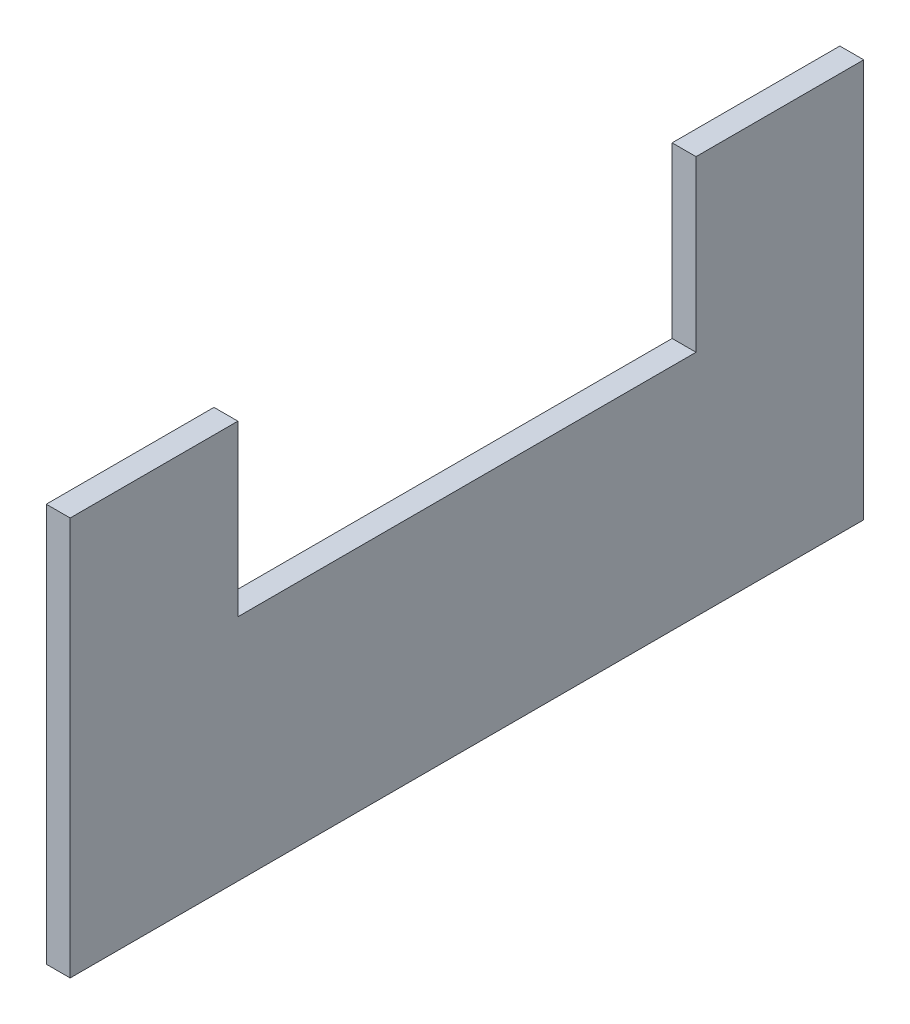
ISO-10303-21;
HEADER;
FILE_DESCRIPTION(('STEP AP214'),'2;1');
FILE_NAME('part.step','',(''),(''),'','','');
FILE_SCHEMA(('AUTOMOTIVE_DESIGN { 1 0 10303 214 1 1 1 1 }'));
ENDSEC;
DATA;
#1=APPLICATION_CONTEXT('core data for automotive mechanical design processes');
#2=APPLICATION_PROTOCOL_DEFINITION('international standard','automotive_design',2000,#1);
#3=PRODUCT_CONTEXT('',#1,'mechanical');
#4=PRODUCT('Part','Part','',(#3));
#5=PRODUCT_RELATED_PRODUCT_CATEGORY('part','',(#4));
#6=PRODUCT_DEFINITION_FORMATION('','',#4);
#7=PRODUCT_DEFINITION_CONTEXT('part definition',#1,'design');
#8=PRODUCT_DEFINITION('design','',#6,#7);
#9=PRODUCT_DEFINITION_SHAPE('','',#8);
#10=(LENGTH_UNIT() NAMED_UNIT(*) SI_UNIT(.MILLI.,.METRE.));
#11=(NAMED_UNIT(*) PLANE_ANGLE_UNIT() SI_UNIT($,.RADIAN.));
#12=(NAMED_UNIT(*) SI_UNIT($,.STERADIAN.) SOLID_ANGLE_UNIT());
#13=UNCERTAINTY_MEASURE_WITH_UNIT(LENGTH_MEASURE(1.E-05),#10,'distance_accuracy_value','');
#14=(GEOMETRIC_REPRESENTATION_CONTEXT(3) GLOBAL_UNCERTAINTY_ASSIGNED_CONTEXT((#13)) GLOBAL_UNIT_ASSIGNED_CONTEXT((#10,
#11,#12)) REPRESENTATION_CONTEXT('',''));
#15=CARTESIAN_POINT('',(0.,0.,0.));
#16=DIRECTION('',(0.,0.,1.));
#17=DIRECTION('',(1.,0.,0.));
#18=AXIS2_PLACEMENT_3D('',#15,#16,#17);
#19=CARTESIAN_POINT('',(3.,25.,-49.8));
#20=DIRECTION('',(0.,0.,1.));
#21=DIRECTION('',(1.,0.,0.));
#22=AXIS2_PLACEMENT_3D('',#19,#20,#21);
#23=PLANE('',#22);
#24=DIRECTION('',(0.,1.,0.));
#25=VECTOR('',#24,1.);
#26=CARTESIAN_POINT('',(0.,25.,-49.8));
#27=LINE('',#26,#25);
#28=CARTESIAN_POINT('',(0.,-25.,-49.8));
#29=VERTEX_POINT('',#28);
#30=CARTESIAN_POINT('',(0.,25.,-49.8));
#31=VERTEX_POINT('',#30);
#32=EDGE_CURVE('E129',#29,#31,#27,.T.);
#33=ORIENTED_EDGE('',*,*,#32,.T.);
#34=DIRECTION('',(-1.,0.,0.));
#35=VECTOR('',#34,1.);
#36=CARTESIAN_POINT('',(3.,25.,-49.8));
#37=LINE('',#36,#35);
#38=CARTESIAN_POINT('',(3.,25.,-49.8));
#39=VERTEX_POINT('',#38);
#40=EDGE_CURVE('E11',#39,#31,#37,.T.);
#41=ORIENTED_EDGE('',*,*,#40,.F.);
#42=DIRECTION('',(0.,1.,0.));
#43=VECTOR('',#42,1.);
#44=CARTESIAN_POINT('',(3.,25.,-49.8));
#45=LINE('',#44,#43);
#46=CARTESIAN_POINT('',(3.,-25.,-49.8));
#47=VERTEX_POINT('',#46);
#48=EDGE_CURVE('E143',#47,#39,#45,.T.);
#49=ORIENTED_EDGE('',*,*,#48,.F.);
#50=DIRECTION('',(-1.,0.,0.));
#51=VECTOR('',#50,1.);
#52=CARTESIAN_POINT('',(3.,-25.,-49.8));
#53=LINE('',#52,#51);
#54=EDGE_CURVE('E125',#47,#29,#53,.T.);
#55=ORIENTED_EDGE('',*,*,#54,.T.);
#56=EDGE_LOOP('',(#33,#41,#49,#55));
#57=FACE_BOUND('',#56,.T.);
#58=ADVANCED_FACE('F33',(#57),#23,.F.);
#59=CARTESIAN_POINT('',(3.,25.,-28.75));
#60=DIRECTION('',(0.,-1.,0.));
#61=DIRECTION('',(0.,0.,-1.));
#62=AXIS2_PLACEMENT_3D('',#59,#60,#61);
#63=PLANE('',#62);
#64=DIRECTION('',(0.,0.,1.));
#65=VECTOR('',#64,1.);
#66=CARTESIAN_POINT('',(0.,25.,-28.75));
#67=LINE('',#66,#65);
#68=CARTESIAN_POINT('',(0.,25.,-28.75));
#69=VERTEX_POINT('',#68);
#70=EDGE_CURVE('E132',#31,#69,#67,.T.);
#71=ORIENTED_EDGE('',*,*,#70,.T.);
#72=DIRECTION('',(-1.,0.,0.));
#73=VECTOR('',#72,1.);
#74=CARTESIAN_POINT('',(3.,25.,-28.75));
#75=LINE('',#74,#73);
#76=CARTESIAN_POINT('',(3.,25.,-28.75));
#77=VERTEX_POINT('',#76);
#78=EDGE_CURVE('E41',#77,#69,#75,.T.);
#79=ORIENTED_EDGE('',*,*,#78,.F.);
#80=DIRECTION('',(0.,0.,1.));
#81=VECTOR('',#80,1.);
#82=CARTESIAN_POINT('',(3.,25.,-28.75));
#83=LINE('',#82,#81);
#84=EDGE_CURVE('E92',#39,#77,#83,.T.);
#85=ORIENTED_EDGE('',*,*,#84,.F.);
#86=ORIENTED_EDGE('',*,*,#40,.T.);
#87=EDGE_LOOP('',(#71,#79,#85,#86));
#88=FACE_BOUND('',#87,.T.);
#89=ADVANCED_FACE('F178',(#88),#63,.F.);
#90=CARTESIAN_POINT('',(3.,3.73691505291163,-28.75));
#91=DIRECTION('',(0.,0.,-1.));
#92=DIRECTION('',(-1.,0.,0.));
#93=AXIS2_PLACEMENT_3D('',#90,#91,#92);
#94=PLANE('',#93);
#95=DIRECTION('',(0.,-1.,0.));
#96=VECTOR('',#95,1.);
#97=CARTESIAN_POINT('',(0.,3.73691505291163,-28.75));
#98=LINE('',#97,#96);
#99=CARTESIAN_POINT('',(0.,3.73691505291163,-28.75));
#100=VERTEX_POINT('',#99);
#101=EDGE_CURVE('E134',#69,#100,#98,.T.);
#102=ORIENTED_EDGE('',*,*,#101,.T.);
#103=DIRECTION('',(-1.,0.,0.));
#104=VECTOR('',#103,1.);
#105=CARTESIAN_POINT('',(3.,3.73691505291163,-28.75));
#106=LINE('',#105,#104);
#107=CARTESIAN_POINT('',(3.,3.73691505291163,-28.75));
#108=VERTEX_POINT('',#107);
#109=EDGE_CURVE('E150',#108,#100,#106,.T.);
#110=ORIENTED_EDGE('',*,*,#109,.F.);
#111=DIRECTION('',(0.,-1.,0.));
#112=VECTOR('',#111,1.);
#113=CARTESIAN_POINT('',(3.,3.73691505291163,-28.75));
#114=LINE('',#113,#112);
#115=EDGE_CURVE('E158',#77,#108,#114,.T.);
#116=ORIENTED_EDGE('',*,*,#115,.F.);
#117=ORIENTED_EDGE('',*,*,#78,.T.);
#118=EDGE_LOOP('',(#102,#110,#116,#117));
#119=FACE_BOUND('',#118,.T.);
#120=ADVANCED_FACE('F156',(#119),#94,.F.);
#121=CARTESIAN_POINT('',(3.,3.73691505291163,28.75));
#122=DIRECTION('',(0.,-1.,0.));
#123=DIRECTION('',(0.,0.,-1.));
#124=AXIS2_PLACEMENT_3D('',#121,#122,#123);
#125=PLANE('',#124);
#126=DIRECTION('',(0.,0.,1.));
#127=VECTOR('',#126,1.);
#128=CARTESIAN_POINT('',(0.,3.73691505291163,28.75));
#129=LINE('',#128,#127);
#130=CARTESIAN_POINT('',(0.,3.73691505291163,28.75));
#131=VERTEX_POINT('',#130);
#132=EDGE_CURVE('E136',#100,#131,#129,.T.);
#133=ORIENTED_EDGE('',*,*,#132,.T.);
#134=DIRECTION('',(-1.,0.,0.));
#135=VECTOR('',#134,1.);
#136=CARTESIAN_POINT('',(3.,3.73691505291163,28.75));
#137=LINE('',#136,#135);
#138=CARTESIAN_POINT('',(3.,3.73691505291163,28.75));
#139=VERTEX_POINT('',#138);
#140=EDGE_CURVE('E147',#139,#131,#137,.T.);
#141=ORIENTED_EDGE('',*,*,#140,.F.);
#142=DIRECTION('',(0.,0.,1.));
#143=VECTOR('',#142,1.);
#144=CARTESIAN_POINT('',(3.,3.73691505291163,28.75));
#145=LINE('',#144,#143);
#146=EDGE_CURVE('E170',#108,#139,#145,.T.);
#147=ORIENTED_EDGE('',*,*,#146,.F.);
#148=ORIENTED_EDGE('',*,*,#109,.T.);
#149=EDGE_LOOP('',(#133,#141,#147,#148));
#150=FACE_BOUND('',#149,.T.);
#151=ADVANCED_FACE('F166',(#150),#125,.F.);
#152=CARTESIAN_POINT('',(3.,25.,28.75));
#153=DIRECTION('',(0.,0.,1.));
#154=DIRECTION('',(1.,0.,0.));
#155=AXIS2_PLACEMENT_3D('',#152,#153,#154);
#156=PLANE('',#155);
#157=DIRECTION('',(0.,1.,0.));
#158=VECTOR('',#157,1.);
#159=CARTESIAN_POINT('',(0.,25.,28.75));
#160=LINE('',#159,#158);
#161=CARTESIAN_POINT('',(0.,25.,28.75));
#162=VERTEX_POINT('',#161);
#163=EDGE_CURVE('E138',#131,#162,#160,.T.);
#164=ORIENTED_EDGE('',*,*,#163,.T.);
#165=DIRECTION('',(-1.,0.,0.));
#166=VECTOR('',#165,1.);
#167=CARTESIAN_POINT('',(3.,25.,28.75));
#168=LINE('',#167,#166);
#169=CARTESIAN_POINT('',(3.,25.,28.75));
#170=VERTEX_POINT('',#169);
#171=EDGE_CURVE('E120',#170,#162,#168,.T.);
#172=ORIENTED_EDGE('',*,*,#171,.F.);
#173=DIRECTION('',(0.,1.,0.));
#174=VECTOR('',#173,1.);
#175=CARTESIAN_POINT('',(3.,25.,28.75));
#176=LINE('',#175,#174);
#177=EDGE_CURVE('E111',#139,#170,#176,.T.);
#178=ORIENTED_EDGE('',*,*,#177,.F.);
#179=ORIENTED_EDGE('',*,*,#140,.T.);
#180=EDGE_LOOP('',(#164,#172,#178,#179));
#181=FACE_BOUND('',#180,.T.);
#182=ADVANCED_FACE('F169',(#181),#156,.F.);
#183=CARTESIAN_POINT('',(3.,25.,49.8));
#184=DIRECTION('',(0.,-1.,0.));
#185=DIRECTION('',(0.,0.,-1.));
#186=AXIS2_PLACEMENT_3D('',#183,#184,#185);
#187=PLANE('',#186);
#188=DIRECTION('',(0.,0.,1.));
#189=VECTOR('',#188,1.);
#190=CARTESIAN_POINT('',(0.,25.,49.8));
#191=LINE('',#190,#189);
#192=CARTESIAN_POINT('',(0.,25.,49.8));
#193=VERTEX_POINT('',#192);
#194=EDGE_CURVE('E119',#162,#193,#191,.T.);
#195=ORIENTED_EDGE('',*,*,#194,.T.);
#196=DIRECTION('',(-1.,0.,0.));
#197=VECTOR('',#196,1.);
#198=CARTESIAN_POINT('',(3.,25.,49.8));
#199=LINE('',#198,#197);
#200=CARTESIAN_POINT('',(3.,25.,49.8));
#201=VERTEX_POINT('',#200);
#202=EDGE_CURVE('E116',#201,#193,#199,.T.);
#203=ORIENTED_EDGE('',*,*,#202,.F.);
#204=DIRECTION('',(0.,0.,1.));
#205=VECTOR('',#204,1.);
#206=CARTESIAN_POINT('',(3.,25.,49.8));
#207=LINE('',#206,#205);
#208=EDGE_CURVE('E105',#170,#201,#207,.T.);
#209=ORIENTED_EDGE('',*,*,#208,.F.);
#210=ORIENTED_EDGE('',*,*,#171,.T.);
#211=EDGE_LOOP('',(#195,#203,#209,#210));
#212=FACE_BOUND('',#211,.T.);
#213=ADVANCED_FACE('F117',(#212),#187,.F.);
#214=CARTESIAN_POINT('',(3.,25.,49.8));
#215=DIRECTION('',(0.,0.,-1.));
#216=DIRECTION('',(-1.,0.,0.));
#217=AXIS2_PLACEMENT_3D('',#214,#215,#216);
#218=PLANE('',#217);
#219=DIRECTION('',(0.,-1.,0.));
#220=VECTOR('',#219,1.);
#221=CARTESIAN_POINT('',(0.,25.,49.8));
#222=LINE('',#221,#220);
#223=CARTESIAN_POINT('',(0.,-25.,49.8));
#224=VERTEX_POINT('',#223);
#225=EDGE_CURVE('E78',#193,#224,#222,.T.);
#226=ORIENTED_EDGE('',*,*,#225,.T.);
#227=DIRECTION('',(-1.,0.,0.));
#228=VECTOR('',#227,1.);
#229=CARTESIAN_POINT('',(3.,-25.,49.8));
#230=LINE('',#229,#228);
#231=CARTESIAN_POINT('',(3.,-25.,49.8));
#232=VERTEX_POINT('',#231);
#233=EDGE_CURVE('E121',#232,#224,#230,.T.);
#234=ORIENTED_EDGE('',*,*,#233,.F.);
#235=DIRECTION('',(0.,-1.,0.));
#236=VECTOR('',#235,1.);
#237=CARTESIAN_POINT('',(3.,25.,49.8));
#238=LINE('',#237,#236);
#239=EDGE_CURVE('E109',#201,#232,#238,.T.);
#240=ORIENTED_EDGE('',*,*,#239,.F.);
#241=ORIENTED_EDGE('',*,*,#202,.T.);
#242=EDGE_LOOP('',(#226,#234,#240,#241));
#243=FACE_BOUND('',#242,.T.);
#244=ADVANCED_FACE('F123',(#243),#218,.F.);
#245=CARTESIAN_POINT('',(3.,-25.,49.8));
#246=DIRECTION('',(0.,1.,0.));
#247=DIRECTION('',(0.,0.,1.));
#248=AXIS2_PLACEMENT_3D('',#245,#246,#247);
#249=PLANE('',#248);
#250=DIRECTION('',(0.,0.,-1.));
#251=VECTOR('',#250,1.);
#252=CARTESIAN_POINT('',(0.,-25.,49.8));
#253=LINE('',#252,#251);
#254=EDGE_CURVE('E84',#224,#29,#253,.T.);
#255=ORIENTED_EDGE('',*,*,#254,.T.);
#256=ORIENTED_EDGE('',*,*,#54,.F.);
#257=DIRECTION('',(0.,0.,-1.));
#258=VECTOR('',#257,1.);
#259=CARTESIAN_POINT('',(3.,-25.,49.8));
#260=LINE('',#259,#258);
#261=EDGE_CURVE('E49',#232,#47,#260,.T.);
#262=ORIENTED_EDGE('',*,*,#261,.F.);
#263=ORIENTED_EDGE('',*,*,#233,.T.);
#264=EDGE_LOOP('',(#255,#256,#262,#263));
#265=FACE_BOUND('',#264,.T.);
#266=ADVANCED_FACE('F194',(#265),#249,.F.);
#267=CARTESIAN_POINT('',(3.,0.,0.));
#268=DIRECTION('',(1.,0.,0.));
#269=DIRECTION('',(0.,0.,-1.));
#270=AXIS2_PLACEMENT_3D('',#267,#268,#269);
#271=PLANE('',#270);
#272=ORIENTED_EDGE('',*,*,#48,.T.);
#273=ORIENTED_EDGE('',*,*,#84,.T.);
#274=ORIENTED_EDGE('',*,*,#115,.T.);
#275=ORIENTED_EDGE('',*,*,#146,.T.);
#276=ORIENTED_EDGE('',*,*,#177,.T.);
#277=ORIENTED_EDGE('',*,*,#208,.T.);
#278=ORIENTED_EDGE('',*,*,#239,.T.);
#279=ORIENTED_EDGE('',*,*,#261,.T.);
#280=EDGE_LOOP('',(#272,#273,#274,#275,#276,#277,#278,#279));
#281=FACE_BOUND('',#280,.T.);
#282=ADVANCED_FACE('F107',(#281),#271,.T.);
#283=CARTESIAN_POINT('',(0.,0.,0.));
#284=DIRECTION('',(1.,0.,0.));
#285=DIRECTION('',(0.,0.,-1.));
#286=AXIS2_PLACEMENT_3D('',#283,#284,#285);
#287=PLANE('',#286);
#288=ORIENTED_EDGE('',*,*,#32,.F.);
#289=ORIENTED_EDGE('',*,*,#254,.F.);
#290=ORIENTED_EDGE('',*,*,#225,.F.);
#291=ORIENTED_EDGE('',*,*,#194,.F.);
#292=ORIENTED_EDGE('',*,*,#163,.F.);
#293=ORIENTED_EDGE('',*,*,#132,.F.);
#294=ORIENTED_EDGE('',*,*,#101,.F.);
#295=ORIENTED_EDGE('',*,*,#70,.F.);
#296=EDGE_LOOP('',(#288,#289,#290,#291,#292,#293,#294,#295));
#297=FACE_BOUND('',#296,.T.);
#298=ADVANCED_FACE('F162',(#297),#287,.F.);
#299=CLOSED_SHELL('',(#58,#89,#120,#151,#182,#213,#244,#266,#282,#298));
#300=MANIFOLD_SOLID_BREP('B2',#299);
#301=ADVANCED_BREP_SHAPE_REPRESENTATION('',(#18,#300),#14);
#302=SHAPE_DEFINITION_REPRESENTATION(#9,#301);
ENDSEC;
END-ISO-10303-21;
